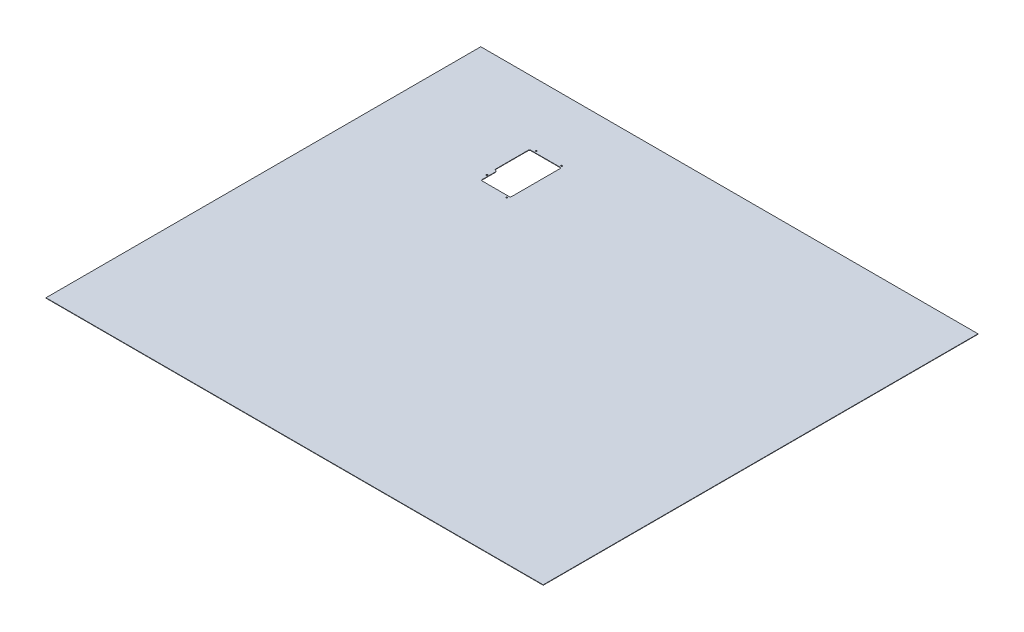
ISO-10303-21;
HEADER;
FILE_DESCRIPTION(('STEP AP214'),'2;1');
FILE_NAME('part.step','',(''),(''),'','','');
FILE_SCHEMA(('AUTOMOTIVE_DESIGN { 1 0 10303 214 1 1 1 1 }'));
ENDSEC;
DATA;
#1=APPLICATION_CONTEXT('core data for automotive mechanical design processes');
#2=APPLICATION_PROTOCOL_DEFINITION('international standard','automotive_design',2000,#1);
#3=PRODUCT_CONTEXT('',#1,'mechanical');
#4=PRODUCT('Part','Part','',(#3));
#5=PRODUCT_RELATED_PRODUCT_CATEGORY('part','',(#4));
#6=PRODUCT_DEFINITION_FORMATION('','',#4);
#7=PRODUCT_DEFINITION_CONTEXT('part definition',#1,'design');
#8=PRODUCT_DEFINITION('design','',#6,#7);
#9=PRODUCT_DEFINITION_SHAPE('','',#8);
#10=(LENGTH_UNIT() NAMED_UNIT(*) SI_UNIT(.MILLI.,.METRE.));
#11=(NAMED_UNIT(*) PLANE_ANGLE_UNIT() SI_UNIT($,.RADIAN.));
#12=(NAMED_UNIT(*) SI_UNIT($,.STERADIAN.) SOLID_ANGLE_UNIT());
#13=UNCERTAINTY_MEASURE_WITH_UNIT(LENGTH_MEASURE(1.E-05),#10,'distance_accuracy_value','');
#14=(GEOMETRIC_REPRESENTATION_CONTEXT(3) GLOBAL_UNCERTAINTY_ASSIGNED_CONTEXT((#13)) GLOBAL_UNIT_ASSIGNED_CONTEXT((#10,
#11,#12)) REPRESENTATION_CONTEXT('',''));
#15=CARTESIAN_POINT('',(0.,0.,0.));
#16=DIRECTION('',(0.,0.,1.));
#17=DIRECTION('',(1.,0.,0.));
#18=AXIS2_PLACEMENT_3D('',#15,#16,#17);
#19=CARTESIAN_POINT('',(0.,1.,0.));
#20=DIRECTION('',(0.,1.,0.));
#21=DIRECTION('',(0.,0.,1.));
#22=AXIS2_PLACEMENT_3D('',#19,#20,#21);
#23=PLANE('',#22);
#24=CARTESIAN_POINT('',(-328.,1.,-389.));
#25=DIRECTION('',(0.,1.,0.));
#26=DIRECTION('',(0.,0.,1.));
#27=AXIS2_PLACEMENT_3D('',#24,#25,#26);
#28=CIRCLE('',#27,1.74999999999998);
#29=CARTESIAN_POINT('',(-328.,1.,-387.25));
#30=VERTEX_POINT('',#29);
#31=EDGE_CURVE('E240',#30,#30,#28,.T.);
#32=ORIENTED_EDGE('',*,*,#31,.F.);
#33=EDGE_LOOP('',(#32));
#34=FACE_BOUND('',#33,.T.);
#35=CARTESIAN_POINT('',(-338.,1.,-275.));
#36=DIRECTION('',(0.,1.,0.));
#37=DIRECTION('',(0.,0.,1.));
#38=AXIS2_PLACEMENT_3D('',#35,#36,#37);
#39=CIRCLE('',#38,1.74999999999998);
#40=CARTESIAN_POINT('',(-338.,1.,-273.25));
#41=VERTEX_POINT('',#40);
#42=EDGE_CURVE('E345',#41,#41,#39,.T.);
#43=ORIENTED_EDGE('',*,*,#42,.F.);
#44=EDGE_LOOP('',(#43));
#45=FACE_BOUND('',#44,.T.);
#46=CARTESIAN_POINT('',(-264.,1.,-251.));
#47=DIRECTION('',(0.,1.,0.));
#48=DIRECTION('',(0.,0.,1.));
#49=AXIS2_PLACEMENT_3D('',#46,#47,#48);
#50=CIRCLE('',#49,1.74999999999998);
#51=CARTESIAN_POINT('',(-264.,1.,-249.25));
#52=VERTEX_POINT('',#51);
#53=EDGE_CURVE('E253',#52,#52,#50,.T.);
#54=ORIENTED_EDGE('',*,*,#53,.F.);
#55=EDGE_LOOP('',(#54));
#56=FACE_BOUND('',#55,.T.);
#57=CARTESIAN_POINT('',(-264.,1.,-389.));
#58=DIRECTION('',(0.,1.,0.));
#59=DIRECTION('',(0.,0.,1.));
#60=AXIS2_PLACEMENT_3D('',#57,#58,#59);
#61=CIRCLE('',#60,1.74999999999998);
#62=CARTESIAN_POINT('',(-264.,1.,-387.25));
#63=VERTEX_POINT('',#62);
#64=EDGE_CURVE('E236',#63,#63,#61,.T.);
#65=ORIENTED_EDGE('',*,*,#64,.F.);
#66=EDGE_LOOP('',(#65));
#67=FACE_BOUND('',#66,.T.);
#68=DIRECTION('',(0.,0.,-1.));
#69=VECTOR('',#68,1.);
#70=CARTESIAN_POINT('',(625.,1.,-546.5));
#71=LINE('',#70,#69);
#72=CARTESIAN_POINT('',(625.,1.,546.5));
#73=VERTEX_POINT('',#72);
#74=CARTESIAN_POINT('',(625.,1.,-546.5));
#75=VERTEX_POINT('',#74);
#76=EDGE_CURVE('E153',#73,#75,#71,.T.);
#77=ORIENTED_EDGE('',*,*,#76,.T.);
#78=DIRECTION('',(-1.,0.,0.));
#79=VECTOR('',#78,1.);
#80=CARTESIAN_POINT('',(-625.,1.,-546.5));
#81=LINE('',#80,#79);
#82=CARTESIAN_POINT('',(-625.,1.,-546.5));
#83=VERTEX_POINT('',#82);
#84=EDGE_CURVE('E142',#75,#83,#81,.T.);
#85=ORIENTED_EDGE('',*,*,#84,.T.);
#86=DIRECTION('',(0.,0.,1.));
#87=VECTOR('',#86,1.);
#88=CARTESIAN_POINT('',(-625.,1.,-546.5));
#89=LINE('',#88,#87);
#90=CARTESIAN_POINT('',(-625.,1.,546.5));
#91=VERTEX_POINT('',#90);
#92=EDGE_CURVE('E152',#83,#91,#89,.T.);
#93=ORIENTED_EDGE('',*,*,#92,.T.);
#94=DIRECTION('',(1.,0.,0.));
#95=VECTOR('',#94,1.);
#96=CARTESIAN_POINT('',(-625.,1.,546.5));
#97=LINE('',#96,#95);
#98=EDGE_CURVE('E158',#91,#73,#97,.T.);
#99=ORIENTED_EDGE('',*,*,#98,.T.);
#100=EDGE_LOOP('',(#77,#85,#93,#99));
#101=FACE_BOUND('',#100,.T.);
#102=DIRECTION('',(0.,0.,-1.));
#103=VECTOR('',#102,1.);
#104=CARTESIAN_POINT('',(-334.,1.,0.));
#105=LINE('',#104,#103);
#106=CARTESIAN_POINT('',(-334.,1.,-259.));
#107=VERTEX_POINT('',#106);
#108=CARTESIAN_POINT('',(-334.,1.,-293.));
#109=VERTEX_POINT('',#108);
#110=EDGE_CURVE('E232',#107,#109,#105,.T.);
#111=ORIENTED_EDGE('',*,*,#110,.T.);
#112=CARTESIAN_POINT('',(-337.,1.,-293.));
#113=DIRECTION('',(0.,1.,0.));
#114=DIRECTION('',(0.,0.,1.));
#115=AXIS2_PLACEMENT_3D('',#112,#113,#114);
#116=CIRCLE('',#115,3.);
#117=CARTESIAN_POINT('',(-337.,1.,-296.));
#118=VERTEX_POINT('',#117);
#119=EDGE_CURVE('E200',#109,#118,#116,.T.);
#120=ORIENTED_EDGE('',*,*,#119,.T.);
#121=CARTESIAN_POINT('',(-337.,1.,-299.));
#122=DIRECTION('',(0.,1.,0.));
#123=DIRECTION('',(0.,0.,1.));
#124=AXIS2_PLACEMENT_3D('',#121,#122,#123);
#125=CIRCLE('',#124,3.);
#126=CARTESIAN_POINT('',(-340.,1.,-299.));
#127=VERTEX_POINT('',#126);
#128=EDGE_CURVE('E222',#118,#127,#125,.F.);
#129=ORIENTED_EDGE('',*,*,#128,.T.);
#130=DIRECTION('',(0.,0.,-1.));
#131=VECTOR('',#130,1.);
#132=CARTESIAN_POINT('',(-340.,1.,0.));
#133=LINE('',#132,#131);
#134=CARTESIAN_POINT('',(-340.,1.,-381.));
#135=VERTEX_POINT('',#134);
#136=EDGE_CURVE('E266',#127,#135,#133,.T.);
#137=ORIENTED_EDGE('',*,*,#136,.T.);
#138=CARTESIAN_POINT('',(-337.,1.,-381.));
#139=DIRECTION('',(0.,1.,0.));
#140=DIRECTION('',(0.,0.,1.));
#141=AXIS2_PLACEMENT_3D('',#138,#139,#140);
#142=CIRCLE('',#141,3.);
#143=CARTESIAN_POINT('',(-337.,1.,-384.));
#144=VERTEX_POINT('',#143);
#145=EDGE_CURVE('E225',#135,#144,#142,.F.);
#146=ORIENTED_EDGE('',*,*,#145,.T.);
#147=DIRECTION('',(-1.,0.,0.));
#148=VECTOR('',#147,1.);
#149=CARTESIAN_POINT('',(0.,1.,-384.));
#150=LINE('',#149,#148);
#151=CARTESIAN_POINT('',(-263.,1.,-384.));
#152=VERTEX_POINT('',#151);
#153=EDGE_CURVE('E263',#152,#144,#150,.T.);
#154=ORIENTED_EDGE('',*,*,#153,.F.);
#155=CARTESIAN_POINT('',(-263.,1.,-381.));
#156=DIRECTION('',(0.,1.,0.));
#157=DIRECTION('',(0.,0.,1.));
#158=AXIS2_PLACEMENT_3D('',#155,#156,#157);
#159=CIRCLE('',#158,3.);
#160=CARTESIAN_POINT('',(-260.,1.,-381.));
#161=VERTEX_POINT('',#160);
#162=EDGE_CURVE('E42',#152,#161,#159,.F.);
#163=ORIENTED_EDGE('',*,*,#162,.T.);
#164=DIRECTION('',(0.,0.,-1.));
#165=VECTOR('',#164,1.);
#166=CARTESIAN_POINT('',(-260.,1.,0.));
#167=LINE('',#166,#165);
#168=CARTESIAN_POINT('',(-260.,1.,-259.));
#169=VERTEX_POINT('',#168);
#170=EDGE_CURVE('E260',#169,#161,#167,.T.);
#171=ORIENTED_EDGE('',*,*,#170,.F.);
#172=CARTESIAN_POINT('',(-263.,1.,-259.));
#173=DIRECTION('',(0.,1.,0.));
#174=DIRECTION('',(0.,0.,1.));
#175=AXIS2_PLACEMENT_3D('',#172,#173,#174);
#176=CIRCLE('',#175,3.);
#177=CARTESIAN_POINT('',(-263.,1.,-256.));
#178=VERTEX_POINT('',#177);
#179=EDGE_CURVE('E214',#169,#178,#176,.F.);
#180=ORIENTED_EDGE('',*,*,#179,.T.);
#181=DIRECTION('',(-1.,0.,0.));
#182=VECTOR('',#181,1.);
#183=CARTESIAN_POINT('',(0.,1.,-256.));
#184=LINE('',#183,#182);
#185=CARTESIAN_POINT('',(-331.,1.,-256.));
#186=VERTEX_POINT('',#185);
#187=EDGE_CURVE('E257',#178,#186,#184,.T.);
#188=ORIENTED_EDGE('',*,*,#187,.T.);
#189=CARTESIAN_POINT('',(-331.,1.,-259.));
#190=DIRECTION('',(0.,1.,0.));
#191=DIRECTION('',(0.,0.,1.));
#192=AXIS2_PLACEMENT_3D('',#189,#190,#191);
#193=CIRCLE('',#192,3.);
#194=EDGE_CURVE('E218',#186,#107,#193,.F.);
#195=ORIENTED_EDGE('',*,*,#194,.T.);
#196=EDGE_LOOP('',(#111,#120,#129,#137,#146,#154,#163,#171,#180,#188,#195));
#197=FACE_BOUND('',#196,.T.);
#198=ADVANCED_FACE('F33',(#34,#45,#56,#67,#101,#197),#23,.T.);
#199=CARTESIAN_POINT('',(0.,0.,0.));
#200=DIRECTION('',(0.,1.,0.));
#201=DIRECTION('',(0.,0.,1.));
#202=AXIS2_PLACEMENT_3D('',#199,#200,#201);
#203=PLANE('',#202);
#204=CARTESIAN_POINT('',(-328.,0.,-389.));
#205=DIRECTION('',(0.,1.,0.));
#206=DIRECTION('',(0.,0.,1.));
#207=AXIS2_PLACEMENT_3D('',#204,#205,#206);
#208=CIRCLE('',#207,1.74999999999998);
#209=CARTESIAN_POINT('',(-328.,0.,-387.25));
#210=VERTEX_POINT('',#209);
#211=EDGE_CURVE('E37',#210,#210,#208,.T.);
#212=ORIENTED_EDGE('',*,*,#211,.T.);
#213=EDGE_LOOP('',(#212));
#214=FACE_BOUND('',#213,.T.);
#215=CARTESIAN_POINT('',(-338.,0.,-275.));
#216=DIRECTION('',(0.,1.,0.));
#217=DIRECTION('',(0.,0.,1.));
#218=AXIS2_PLACEMENT_3D('',#215,#216,#217);
#219=CIRCLE('',#218,1.74999999999998);
#220=CARTESIAN_POINT('',(-338.,0.,-273.25));
#221=VERTEX_POINT('',#220);
#222=EDGE_CURVE('E239',#221,#221,#219,.T.);
#223=ORIENTED_EDGE('',*,*,#222,.T.);
#224=EDGE_LOOP('',(#223));
#225=FACE_BOUND('',#224,.T.);
#226=CARTESIAN_POINT('',(-264.,0.,-251.));
#227=DIRECTION('',(0.,1.,0.));
#228=DIRECTION('',(0.,0.,1.));
#229=AXIS2_PLACEMENT_3D('',#226,#227,#228);
#230=CIRCLE('',#229,1.74999999999998);
#231=CARTESIAN_POINT('',(-264.,0.,-249.25));
#232=VERTEX_POINT('',#231);
#233=EDGE_CURVE('E237',#232,#232,#230,.T.);
#234=ORIENTED_EDGE('',*,*,#233,.T.);
#235=EDGE_LOOP('',(#234));
#236=FACE_BOUND('',#235,.T.);
#237=CARTESIAN_POINT('',(-264.,0.,-389.));
#238=DIRECTION('',(0.,1.,0.));
#239=DIRECTION('',(0.,0.,1.));
#240=AXIS2_PLACEMENT_3D('',#237,#238,#239);
#241=CIRCLE('',#240,1.74999999999998);
#242=CARTESIAN_POINT('',(-264.,0.,-387.25));
#243=VERTEX_POINT('',#242);
#244=EDGE_CURVE('E233',#243,#243,#241,.T.);
#245=ORIENTED_EDGE('',*,*,#244,.T.);
#246=EDGE_LOOP('',(#245));
#247=FACE_BOUND('',#246,.T.);
#248=DIRECTION('',(0.,0.,-1.));
#249=VECTOR('',#248,1.);
#250=CARTESIAN_POINT('',(625.,0.,-546.5));
#251=LINE('',#250,#249);
#252=CARTESIAN_POINT('',(625.,0.,546.5));
#253=VERTEX_POINT('',#252);
#254=CARTESIAN_POINT('',(625.,0.,-546.5));
#255=VERTEX_POINT('',#254);
#256=EDGE_CURVE('E166',#253,#255,#251,.T.);
#257=ORIENTED_EDGE('',*,*,#256,.F.);
#258=DIRECTION('',(1.,0.,0.));
#259=VECTOR('',#258,1.);
#260=CARTESIAN_POINT('',(-625.,0.,546.5));
#261=LINE('',#260,#259);
#262=CARTESIAN_POINT('',(-625.,0.,546.5));
#263=VERTEX_POINT('',#262);
#264=EDGE_CURVE('E162',#263,#253,#261,.T.);
#265=ORIENTED_EDGE('',*,*,#264,.F.);
#266=DIRECTION('',(0.,0.,1.));
#267=VECTOR('',#266,1.);
#268=CARTESIAN_POINT('',(-625.,0.,-546.5));
#269=LINE('',#268,#267);
#270=CARTESIAN_POINT('',(-625.,0.,-546.5));
#271=VERTEX_POINT('',#270);
#272=EDGE_CURVE('E275',#271,#263,#269,.T.);
#273=ORIENTED_EDGE('',*,*,#272,.F.);
#274=DIRECTION('',(-1.,0.,0.));
#275=VECTOR('',#274,1.);
#276=CARTESIAN_POINT('',(-625.,0.,-546.5));
#277=LINE('',#276,#275);
#278=EDGE_CURVE('E273',#255,#271,#277,.T.);
#279=ORIENTED_EDGE('',*,*,#278,.F.);
#280=EDGE_LOOP('',(#257,#265,#273,#279));
#281=FACE_BOUND('',#280,.T.);
#282=DIRECTION('',(0.,0.,-1.));
#283=VECTOR('',#282,1.);
#284=CARTESIAN_POINT('',(-340.,0.,0.));
#285=LINE('',#284,#283);
#286=CARTESIAN_POINT('',(-340.,0.,-299.));
#287=VERTEX_POINT('',#286);
#288=CARTESIAN_POINT('',(-340.,0.,-381.));
#289=VERTEX_POINT('',#288);
#290=EDGE_CURVE('E180',#287,#289,#285,.T.);
#291=ORIENTED_EDGE('',*,*,#290,.F.);
#292=CARTESIAN_POINT('',(-337.,0.,-299.));
#293=DIRECTION('',(0.,1.,0.));
#294=DIRECTION('',(0.,0.,1.));
#295=AXIS2_PLACEMENT_3D('',#292,#293,#294);
#296=CIRCLE('',#295,3.);
#297=CARTESIAN_POINT('',(-337.,0.,-296.));
#298=VERTEX_POINT('',#297);
#299=EDGE_CURVE('E50',#287,#298,#296,.T.);
#300=ORIENTED_EDGE('',*,*,#299,.T.);
#301=CARTESIAN_POINT('',(-337.,0.,-293.));
#302=DIRECTION('',(0.,1.,0.));
#303=DIRECTION('',(0.,0.,1.));
#304=AXIS2_PLACEMENT_3D('',#301,#302,#303);
#305=CIRCLE('',#304,3.);
#306=CARTESIAN_POINT('',(-334.,0.,-293.));
#307=VERTEX_POINT('',#306);
#308=EDGE_CURVE('E202',#298,#307,#305,.F.);
#309=ORIENTED_EDGE('',*,*,#308,.T.);
#310=DIRECTION('',(0.,0.,-1.));
#311=VECTOR('',#310,1.);
#312=CARTESIAN_POINT('',(-334.,0.,0.));
#313=LINE('',#312,#311);
#314=CARTESIAN_POINT('',(-334.,0.,-259.));
#315=VERTEX_POINT('',#314);
#316=EDGE_CURVE('E182',#315,#307,#313,.T.);
#317=ORIENTED_EDGE('',*,*,#316,.F.);
#318=CARTESIAN_POINT('',(-331.,0.,-259.));
#319=DIRECTION('',(0.,1.,0.));
#320=DIRECTION('',(0.,0.,1.));
#321=AXIS2_PLACEMENT_3D('',#318,#319,#320);
#322=CIRCLE('',#321,3.);
#323=CARTESIAN_POINT('',(-331.,0.,-256.));
#324=VERTEX_POINT('',#323);
#325=EDGE_CURVE('E220',#315,#324,#322,.T.);
#326=ORIENTED_EDGE('',*,*,#325,.T.);
#327=DIRECTION('',(-1.,0.,0.));
#328=VECTOR('',#327,1.);
#329=CARTESIAN_POINT('',(0.,0.,-256.));
#330=LINE('',#329,#328);
#331=CARTESIAN_POINT('',(-263.,0.,-256.));
#332=VERTEX_POINT('',#331);
#333=EDGE_CURVE('E167',#332,#324,#330,.T.);
#334=ORIENTED_EDGE('',*,*,#333,.F.);
#335=CARTESIAN_POINT('',(-263.,0.,-259.));
#336=DIRECTION('',(0.,1.,0.));
#337=DIRECTION('',(0.,0.,1.));
#338=AXIS2_PLACEMENT_3D('',#335,#336,#337);
#339=CIRCLE('',#338,3.);
#340=CARTESIAN_POINT('',(-260.,0.,-259.));
#341=VERTEX_POINT('',#340);
#342=EDGE_CURVE('E216',#332,#341,#339,.T.);
#343=ORIENTED_EDGE('',*,*,#342,.T.);
#344=DIRECTION('',(0.,0.,-1.));
#345=VECTOR('',#344,1.);
#346=CARTESIAN_POINT('',(-260.,0.,0.));
#347=LINE('',#346,#345);
#348=CARTESIAN_POINT('',(-260.,0.,-381.));
#349=VERTEX_POINT('',#348);
#350=EDGE_CURVE('E170',#341,#349,#347,.T.);
#351=ORIENTED_EDGE('',*,*,#350,.T.);
#352=CARTESIAN_POINT('',(-263.,0.,-381.));
#353=DIRECTION('',(0.,1.,0.));
#354=DIRECTION('',(0.,0.,1.));
#355=AXIS2_PLACEMENT_3D('',#352,#353,#354);
#356=CIRCLE('',#355,3.);
#357=CARTESIAN_POINT('',(-263.,0.,-384.));
#358=VERTEX_POINT('',#357);
#359=EDGE_CURVE('E11',#349,#358,#356,.T.);
#360=ORIENTED_EDGE('',*,*,#359,.T.);
#361=DIRECTION('',(-1.,0.,0.));
#362=VECTOR('',#361,1.);
#363=CARTESIAN_POINT('',(0.,0.,-384.));
#364=LINE('',#363,#362);
#365=CARTESIAN_POINT('',(-337.,0.,-384.));
#366=VERTEX_POINT('',#365);
#367=EDGE_CURVE('E178',#358,#366,#364,.T.);
#368=ORIENTED_EDGE('',*,*,#367,.T.);
#369=CARTESIAN_POINT('',(-337.,0.,-381.));
#370=DIRECTION('',(0.,1.,0.));
#371=DIRECTION('',(0.,0.,1.));
#372=AXIS2_PLACEMENT_3D('',#369,#370,#371);
#373=CIRCLE('',#372,3.);
#374=EDGE_CURVE('E56',#366,#289,#373,.T.);
#375=ORIENTED_EDGE('',*,*,#374,.T.);
#376=EDGE_LOOP('',(#291,#300,#309,#317,#326,#334,#343,#351,#360,#368,#375));
#377=FACE_BOUND('',#376,.T.);
#378=ADVANCED_FACE('F286',(#214,#225,#236,#247,#281,#377),#203,.F.);
#379=CARTESIAN_POINT('',(625.,1.,-546.5));
#380=DIRECTION('',(-1.,0.,0.));
#381=DIRECTION('',(0.,0.,1.));
#382=AXIS2_PLACEMENT_3D('',#379,#380,#381);
#383=PLANE('',#382);
#384=ORIENTED_EDGE('',*,*,#256,.T.);
#385=DIRECTION('',(0.,-1.,0.));
#386=VECTOR('',#385,1.);
#387=CARTESIAN_POINT('',(625.,1.,-546.5));
#388=LINE('',#387,#386);
#389=EDGE_CURVE('E146',#75,#255,#388,.T.);
#390=ORIENTED_EDGE('',*,*,#389,.F.);
#391=ORIENTED_EDGE('',*,*,#76,.F.);
#392=DIRECTION('',(0.,-1.,0.));
#393=VECTOR('',#392,1.);
#394=CARTESIAN_POINT('',(625.,1.,546.5));
#395=LINE('',#394,#393);
#396=EDGE_CURVE('E271',#73,#253,#395,.T.);
#397=ORIENTED_EDGE('',*,*,#396,.T.);
#398=EDGE_LOOP('',(#384,#390,#391,#397));
#399=FACE_BOUND('',#398,.T.);
#400=ADVANCED_FACE('F164',(#399),#383,.F.);
#401=CARTESIAN_POINT('',(-625.,1.,-546.5));
#402=DIRECTION('',(0.,0.,1.));
#403=DIRECTION('',(1.,0.,0.));
#404=AXIS2_PLACEMENT_3D('',#401,#402,#403);
#405=PLANE('',#404);
#406=ORIENTED_EDGE('',*,*,#278,.T.);
#407=DIRECTION('',(0.,-1.,0.));
#408=VECTOR('',#407,1.);
#409=CARTESIAN_POINT('',(-625.,1.,-546.5));
#410=LINE('',#409,#408);
#411=EDGE_CURVE('E149',#83,#271,#410,.T.);
#412=ORIENTED_EDGE('',*,*,#411,.F.);
#413=ORIENTED_EDGE('',*,*,#84,.F.);
#414=ORIENTED_EDGE('',*,*,#389,.T.);
#415=EDGE_LOOP('',(#406,#412,#413,#414));
#416=FACE_BOUND('',#415,.T.);
#417=ADVANCED_FACE('F144',(#416),#405,.F.);
#418=CARTESIAN_POINT('',(-625.,1.,-546.5));
#419=DIRECTION('',(1.,0.,0.));
#420=DIRECTION('',(0.,0.,-1.));
#421=AXIS2_PLACEMENT_3D('',#418,#419,#420);
#422=PLANE('',#421);
#423=ORIENTED_EDGE('',*,*,#272,.T.);
#424=DIRECTION('',(0.,-1.,0.));
#425=VECTOR('',#424,1.);
#426=CARTESIAN_POINT('',(-625.,1.,546.5));
#427=LINE('',#426,#425);
#428=EDGE_CURVE('E172',#91,#263,#427,.T.);
#429=ORIENTED_EDGE('',*,*,#428,.F.);
#430=ORIENTED_EDGE('',*,*,#92,.F.);
#431=ORIENTED_EDGE('',*,*,#411,.T.);
#432=EDGE_LOOP('',(#423,#429,#430,#431));
#433=FACE_BOUND('',#432,.T.);
#434=ADVANCED_FACE('F287',(#433),#422,.F.);
#435=CARTESIAN_POINT('',(-625.,1.,546.5));
#436=DIRECTION('',(0.,0.,-1.));
#437=DIRECTION('',(-1.,0.,0.));
#438=AXIS2_PLACEMENT_3D('',#435,#436,#437);
#439=PLANE('',#438);
#440=ORIENTED_EDGE('',*,*,#264,.T.);
#441=ORIENTED_EDGE('',*,*,#396,.F.);
#442=ORIENTED_EDGE('',*,*,#98,.F.);
#443=ORIENTED_EDGE('',*,*,#428,.T.);
#444=EDGE_LOOP('',(#440,#441,#442,#443));
#445=FACE_BOUND('',#444,.T.);
#446=ADVANCED_FACE('F282',(#445),#439,.F.);
#447=CARTESIAN_POINT('',(-334.,-9.,0.));
#448=DIRECTION('',(1.,0.,0.));
#449=DIRECTION('',(0.,0.,-1.));
#450=AXIS2_PLACEMENT_3D('',#447,#448,#449);
#451=PLANE('',#450);
#452=ORIENTED_EDGE('',*,*,#110,.F.);
#453=DIRECTION('',(0.,1.,0.));
#454=VECTOR('',#453,1.);
#455=CARTESIAN_POINT('',(-334.,0.,-259.));
#456=LINE('',#455,#454);
#457=EDGE_CURVE('E198',#107,#315,#456,.F.);
#458=ORIENTED_EDGE('',*,*,#457,.T.);
#459=ORIENTED_EDGE('',*,*,#316,.T.);
#460=DIRECTION('',(0.,1.,0.));
#461=VECTOR('',#460,1.);
#462=CARTESIAN_POINT('',(-334.,1.,-293.));
#463=LINE('',#462,#461);
#464=EDGE_CURVE('E195',#307,#109,#463,.T.);
#465=ORIENTED_EDGE('',*,*,#464,.T.);
#466=EDGE_LOOP('',(#452,#458,#459,#465));
#467=FACE_BOUND('',#466,.T.);
#468=ADVANCED_FACE('F294',(#467),#451,.T.);
#469=CARTESIAN_POINT('',(-340.,-9.,0.));
#470=DIRECTION('',(1.,0.,0.));
#471=DIRECTION('',(0.,0.,-1.));
#472=AXIS2_PLACEMENT_3D('',#469,#470,#471);
#473=PLANE('',#472);
#474=ORIENTED_EDGE('',*,*,#136,.F.);
#475=DIRECTION('',(0.,1.,0.));
#476=VECTOR('',#475,1.);
#477=CARTESIAN_POINT('',(-340.,-9.,-299.));
#478=LINE('',#477,#476);
#479=EDGE_CURVE('E207',#127,#287,#478,.F.);
#480=ORIENTED_EDGE('',*,*,#479,.T.);
#481=ORIENTED_EDGE('',*,*,#290,.T.);
#482=DIRECTION('',(0.,1.,0.));
#483=VECTOR('',#482,1.);
#484=CARTESIAN_POINT('',(-340.,-9.,-381.));
#485=LINE('',#484,#483);
#486=EDGE_CURVE('E204',#289,#135,#485,.T.);
#487=ORIENTED_EDGE('',*,*,#486,.T.);
#488=EDGE_LOOP('',(#474,#480,#481,#487));
#489=FACE_BOUND('',#488,.T.);
#490=ADVANCED_FACE('F309',(#489),#473,.T.);
#491=CARTESIAN_POINT('',(0.,-9.,-384.));
#492=DIRECTION('',(0.,0.,-1.));
#493=DIRECTION('',(-1.,0.,0.));
#494=AXIS2_PLACEMENT_3D('',#491,#492,#493);
#495=PLANE('',#494);
#496=ORIENTED_EDGE('',*,*,#153,.T.);
#497=DIRECTION('',(0.,1.,0.));
#498=VECTOR('',#497,1.);
#499=CARTESIAN_POINT('',(-337.,-9.,-384.));
#500=LINE('',#499,#498);
#501=EDGE_CURVE('E212',#144,#366,#500,.F.);
#502=ORIENTED_EDGE('',*,*,#501,.T.);
#503=ORIENTED_EDGE('',*,*,#367,.F.);
#504=DIRECTION('',(0.,1.,0.));
#505=VECTOR('',#504,1.);
#506=CARTESIAN_POINT('',(-263.,1.,-384.));
#507=LINE('',#506,#505);
#508=EDGE_CURVE('E209',#358,#152,#507,.T.);
#509=ORIENTED_EDGE('',*,*,#508,.T.);
#510=EDGE_LOOP('',(#496,#502,#503,#509));
#511=FACE_BOUND('',#510,.T.);
#512=ADVANCED_FACE('F319',(#511),#495,.F.);
#513=CARTESIAN_POINT('',(-260.,-9.,0.));
#514=DIRECTION('',(1.,0.,0.));
#515=DIRECTION('',(0.,0.,-1.));
#516=AXIS2_PLACEMENT_3D('',#513,#514,#515);
#517=PLANE('',#516);
#518=ORIENTED_EDGE('',*,*,#350,.F.);
#519=DIRECTION('',(0.,1.,0.));
#520=VECTOR('',#519,1.);
#521=CARTESIAN_POINT('',(-260.,-9.,-259.));
#522=LINE('',#521,#520);
#523=EDGE_CURVE('E187',#341,#169,#522,.T.);
#524=ORIENTED_EDGE('',*,*,#523,.T.);
#525=ORIENTED_EDGE('',*,*,#170,.T.);
#526=DIRECTION('',(0.,1.,0.));
#527=VECTOR('',#526,1.);
#528=CARTESIAN_POINT('',(-260.,0.,-381.));
#529=LINE('',#528,#527);
#530=EDGE_CURVE('E185',#161,#349,#529,.F.);
#531=ORIENTED_EDGE('',*,*,#530,.T.);
#532=EDGE_LOOP('',(#518,#524,#525,#531));
#533=FACE_BOUND('',#532,.T.);
#534=ADVANCED_FACE('F315',(#533),#517,.F.);
#535=CARTESIAN_POINT('',(0.,-9.,-256.));
#536=DIRECTION('',(0.,0.,-1.));
#537=DIRECTION('',(-1.,0.,0.));
#538=AXIS2_PLACEMENT_3D('',#535,#536,#537);
#539=PLANE('',#538);
#540=ORIENTED_EDGE('',*,*,#187,.F.);
#541=DIRECTION('',(0.,1.,0.));
#542=VECTOR('',#541,1.);
#543=CARTESIAN_POINT('',(-263.,-9.,-256.));
#544=LINE('',#543,#542);
#545=EDGE_CURVE('E193',#178,#332,#544,.F.);
#546=ORIENTED_EDGE('',*,*,#545,.T.);
#547=ORIENTED_EDGE('',*,*,#333,.T.);
#548=DIRECTION('',(0.,1.,0.));
#549=VECTOR('',#548,1.);
#550=CARTESIAN_POINT('',(-331.,1.,-256.));
#551=LINE('',#550,#549);
#552=EDGE_CURVE('E190',#324,#186,#551,.T.);
#553=ORIENTED_EDGE('',*,*,#552,.T.);
#554=EDGE_LOOP('',(#540,#546,#547,#553));
#555=FACE_BOUND('',#554,.T.);
#556=ADVANCED_FACE('F311',(#555),#539,.T.);
#557=CARTESIAN_POINT('',(-263.,-9.,-259.));
#558=DIRECTION('',(0.,1.,0.));
#559=DIRECTION('',(0.,0.,1.));
#560=AXIS2_PLACEMENT_3D('',#557,#558,#559);
#561=CYLINDRICAL_SURFACE('',#560,3.);
#562=ORIENTED_EDGE('',*,*,#342,.F.);
#563=ORIENTED_EDGE('',*,*,#545,.F.);
#564=ORIENTED_EDGE('',*,*,#179,.F.);
#565=ORIENTED_EDGE('',*,*,#523,.F.);
#566=EDGE_LOOP('',(#562,#563,#564,#565));
#567=FACE_BOUND('',#566,.T.);
#568=ADVANCED_FACE('F314',(#567),#561,.F.);
#569=CARTESIAN_POINT('',(-331.,-9.,-259.));
#570=DIRECTION('',(0.,-1.,0.));
#571=DIRECTION('',(0.,0.,-1.));
#572=AXIS2_PLACEMENT_3D('',#569,#570,#571);
#573=CYLINDRICAL_SURFACE('',#572,3.);
#574=ORIENTED_EDGE('',*,*,#325,.F.);
#575=ORIENTED_EDGE('',*,*,#457,.F.);
#576=ORIENTED_EDGE('',*,*,#194,.F.);
#577=ORIENTED_EDGE('',*,*,#552,.F.);
#578=EDGE_LOOP('',(#574,#575,#576,#577));
#579=FACE_BOUND('',#578,.T.);
#580=ADVANCED_FACE('F401',(#579),#573,.F.);
#581=CARTESIAN_POINT('',(-337.,-9.,-299.));
#582=DIRECTION('',(0.,1.,0.));
#583=DIRECTION('',(0.,0.,1.));
#584=AXIS2_PLACEMENT_3D('',#581,#582,#583);
#585=CYLINDRICAL_SURFACE('',#584,3.);
#586=DIRECTION('',(0.,1.,0.));
#587=VECTOR('',#586,1.);
#588=CARTESIAN_POINT('',(-337.,-9.,-296.));
#589=LINE('',#588,#587);
#590=EDGE_CURVE('E229',#298,#118,#589,.T.);
#591=ORIENTED_EDGE('',*,*,#590,.F.);
#592=ORIENTED_EDGE('',*,*,#299,.F.);
#593=ORIENTED_EDGE('',*,*,#479,.F.);
#594=ORIENTED_EDGE('',*,*,#128,.F.);
#595=EDGE_LOOP('',(#591,#592,#593,#594));
#596=FACE_BOUND('',#595,.T.);
#597=ADVANCED_FACE('F393',(#596),#585,.F.);
#598=CARTESIAN_POINT('',(-337.,-9.,-293.));
#599=DIRECTION('',(0.,-1.,0.));
#600=DIRECTION('',(0.,0.,-1.));
#601=AXIS2_PLACEMENT_3D('',#598,#599,#600);
#602=CYLINDRICAL_SURFACE('',#601,3.);
#603=ORIENTED_EDGE('',*,*,#308,.F.);
#604=ORIENTED_EDGE('',*,*,#590,.T.);
#605=ORIENTED_EDGE('',*,*,#119,.F.);
#606=ORIENTED_EDGE('',*,*,#464,.F.);
#607=EDGE_LOOP('',(#603,#604,#605,#606));
#608=FACE_BOUND('',#607,.T.);
#609=ADVANCED_FACE('F386',(#608),#602,.T.);
#610=CARTESIAN_POINT('',(-337.,-9.,-381.));
#611=DIRECTION('',(0.,1.,0.));
#612=DIRECTION('',(0.,0.,1.));
#613=AXIS2_PLACEMENT_3D('',#610,#611,#612);
#614=CYLINDRICAL_SURFACE('',#613,3.);
#615=ORIENTED_EDGE('',*,*,#374,.F.);
#616=ORIENTED_EDGE('',*,*,#501,.F.);
#617=ORIENTED_EDGE('',*,*,#145,.F.);
#618=ORIENTED_EDGE('',*,*,#486,.F.);
#619=EDGE_LOOP('',(#615,#616,#617,#618));
#620=FACE_BOUND('',#619,.T.);
#621=ADVANCED_FACE('F379',(#620),#614,.F.);
#622=CARTESIAN_POINT('',(-263.,-9.,-381.));
#623=DIRECTION('',(0.,-1.,0.));
#624=DIRECTION('',(0.,0.,-1.));
#625=AXIS2_PLACEMENT_3D('',#622,#623,#624);
#626=CYLINDRICAL_SURFACE('',#625,3.);
#627=ORIENTED_EDGE('',*,*,#359,.F.);
#628=ORIENTED_EDGE('',*,*,#530,.F.);
#629=ORIENTED_EDGE('',*,*,#162,.F.);
#630=ORIENTED_EDGE('',*,*,#508,.F.);
#631=EDGE_LOOP('',(#627,#628,#629,#630));
#632=FACE_BOUND('',#631,.T.);
#633=ADVANCED_FACE('F35',(#632),#626,.F.);
#634=CARTESIAN_POINT('',(-264.,-9.,-389.));
#635=DIRECTION('',(0.,1.,0.));
#636=DIRECTION('',(0.,0.,1.));
#637=AXIS2_PLACEMENT_3D('',#634,#635,#636);
#638=CYLINDRICAL_SURFACE('',#637,1.74999999999998);
#639=ORIENTED_EDGE('',*,*,#64,.T.);
#640=EDGE_LOOP('',(#639));
#641=FACE_BOUND('',#640,.T.);
#642=ORIENTED_EDGE('',*,*,#244,.F.);
#643=EDGE_LOOP('',(#642));
#644=FACE_BOUND('',#643,.T.);
#645=ADVANCED_FACE('F327',(#641,#644),#638,.F.);
#646=CARTESIAN_POINT('',(-264.,-9.,-251.));
#647=DIRECTION('',(0.,1.,0.));
#648=DIRECTION('',(0.,0.,1.));
#649=AXIS2_PLACEMENT_3D('',#646,#647,#648);
#650=CYLINDRICAL_SURFACE('',#649,1.74999999999998);
#651=ORIENTED_EDGE('',*,*,#53,.T.);
#652=EDGE_LOOP('',(#651));
#653=FACE_BOUND('',#652,.T.);
#654=ORIENTED_EDGE('',*,*,#233,.F.);
#655=EDGE_LOOP('',(#654));
#656=FACE_BOUND('',#655,.T.);
#657=ADVANCED_FACE('F330',(#653,#656),#650,.F.);
#658=CARTESIAN_POINT('',(-338.,-9.,-275.));
#659=DIRECTION('',(0.,1.,0.));
#660=DIRECTION('',(0.,0.,1.));
#661=AXIS2_PLACEMENT_3D('',#658,#659,#660);
#662=CYLINDRICAL_SURFACE('',#661,1.74999999999998);
#663=ORIENTED_EDGE('',*,*,#42,.T.);
#664=EDGE_LOOP('',(#663));
#665=FACE_BOUND('',#664,.T.);
#666=ORIENTED_EDGE('',*,*,#222,.F.);
#667=EDGE_LOOP('',(#666));
#668=FACE_BOUND('',#667,.T.);
#669=ADVANCED_FACE('F333',(#665,#668),#662,.F.);
#670=CARTESIAN_POINT('',(-328.,-9.,-389.));
#671=DIRECTION('',(0.,1.,0.));
#672=DIRECTION('',(0.,0.,1.));
#673=AXIS2_PLACEMENT_3D('',#670,#671,#672);
#674=CYLINDRICAL_SURFACE('',#673,1.74999999999998);
#675=ORIENTED_EDGE('',*,*,#31,.T.);
#676=EDGE_LOOP('',(#675));
#677=FACE_BOUND('',#676,.T.);
#678=ORIENTED_EDGE('',*,*,#211,.F.);
#679=EDGE_LOOP('',(#678));
#680=FACE_BOUND('',#679,.T.);
#681=ADVANCED_FACE('F337',(#677,#680),#674,.F.);
#682=CLOSED_SHELL('',(#198,#378,#400,#417,#434,#446,#468,#490,#512,#534,#556,#568,#580,#597,
#609,#621,#633,#645,#657,#669,#681));
#683=MANIFOLD_SOLID_BREP('B2',#682);
#684=ADVANCED_BREP_SHAPE_REPRESENTATION('',(#18,#683),#14);
#685=SHAPE_DEFINITION_REPRESENTATION(#9,#684);
ENDSEC;
END-ISO-10303-21;
